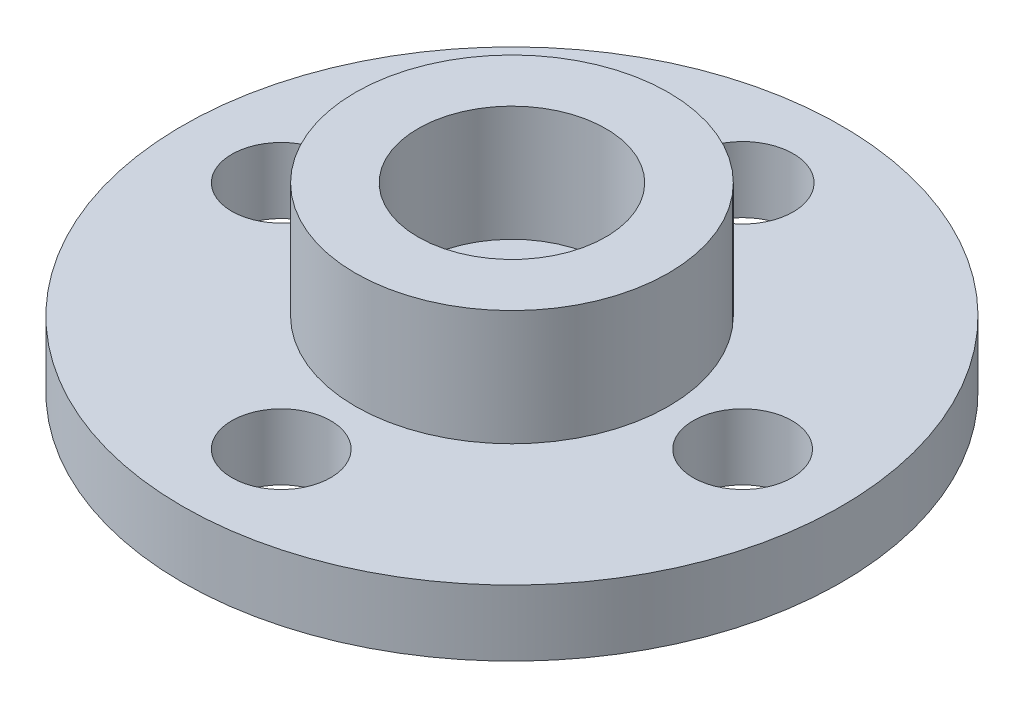
ISO-10303-21;
HEADER;
FILE_DESCRIPTION(('STEP AP214'),'2;1');
FILE_NAME('part.step','',(''),(''),'','','');
FILE_SCHEMA(('AUTOMOTIVE_DESIGN { 1 0 10303 214 1 1 1 1 }'));
ENDSEC;
DATA;
#1=APPLICATION_CONTEXT('core data for automotive mechanical design processes');
#2=APPLICATION_PROTOCOL_DEFINITION('international standard','automotive_design',2000,#1);
#3=PRODUCT_CONTEXT('',#1,'mechanical');
#4=PRODUCT('Part','Part','',(#3));
#5=PRODUCT_RELATED_PRODUCT_CATEGORY('part','',(#4));
#6=PRODUCT_DEFINITION_FORMATION('','',#4);
#7=PRODUCT_DEFINITION_CONTEXT('part definition',#1,'design');
#8=PRODUCT_DEFINITION('design','',#6,#7);
#9=PRODUCT_DEFINITION_SHAPE('','',#8);
#10=(LENGTH_UNIT() NAMED_UNIT(*) SI_UNIT(.MILLI.,.METRE.));
#11=(NAMED_UNIT(*) PLANE_ANGLE_UNIT() SI_UNIT($,.RADIAN.));
#12=(NAMED_UNIT(*) SI_UNIT($,.STERADIAN.) SOLID_ANGLE_UNIT());
#13=UNCERTAINTY_MEASURE_WITH_UNIT(LENGTH_MEASURE(1.E-05),#10,'distance_accuracy_value','');
#14=(GEOMETRIC_REPRESENTATION_CONTEXT(3) GLOBAL_UNCERTAINTY_ASSIGNED_CONTEXT((#13)) GLOBAL_UNIT_ASSIGNED_CONTEXT((#10,
#11,#12)) REPRESENTATION_CONTEXT('',''));
#15=CARTESIAN_POINT('',(0.,0.,0.));
#16=DIRECTION('',(0.,0.,1.));
#17=DIRECTION('',(1.,0.,0.));
#18=AXIS2_PLACEMENT_3D('',#15,#16,#17);
#19=CARTESIAN_POINT('',(0.,2.,0.));
#20=DIRECTION('',(0.,1.,0.));
#21=DIRECTION('',(0.,0.,1.));
#22=AXIS2_PLACEMENT_3D('',#19,#20,#21);
#23=PLANE('',#22);
#24=CARTESIAN_POINT('',(0.,2.,0.));
#25=DIRECTION('',(0.,1.,0.));
#26=DIRECTION('',(0.,0.,1.));
#27=AXIS2_PLACEMENT_3D('',#24,#25,#26);
#28=CIRCLE('',#27,1.5);
#29=CARTESIAN_POINT('',(0.,2.,1.5));
#30=VERTEX_POINT('',#29);
#31=EDGE_CURVE('E50',#30,#30,#28,.T.);
#32=ORIENTED_EDGE('',*,*,#31,.F.);
#33=EDGE_LOOP('',(#32));
#34=FACE_BOUND('',#33,.T.);
#35=CARTESIAN_POINT('',(0.,2.,0.));
#36=DIRECTION('',(0.,1.,0.));
#37=DIRECTION('',(0.,0.,1.));
#38=AXIS2_PLACEMENT_3D('',#35,#36,#37);
#39=CIRCLE('',#38,2.85);
#40=CARTESIAN_POINT('',(0.,2.,2.85));
#41=VERTEX_POINT('',#40);
#42=EDGE_CURVE('E10',#41,#41,#39,.F.);
#43=ORIENTED_EDGE('',*,*,#42,.F.);
#44=EDGE_LOOP('',(#43));
#45=FACE_BOUND('',#44,.T.);
#46=ADVANCED_FACE('F43',(#34,#45),#23,.T.);
#47=CARTESIAN_POINT('',(0.,2.,0.));
#48=DIRECTION('',(0.,-1.,0.));
#49=DIRECTION('',(0.,0.,-1.));
#50=AXIS2_PLACEMENT_3D('',#47,#48,#49);
#51=CYLINDRICAL_SURFACE('',#50,10.);
#52=CARTESIAN_POINT('',(0.,2.,0.));
#53=DIRECTION('',(0.,1.,0.));
#54=DIRECTION('',(0.,0.,1.));
#55=AXIS2_PLACEMENT_3D('',#52,#53,#54);
#56=CIRCLE('',#55,10.);
#57=CARTESIAN_POINT('',(0.,2.,10.));
#58=VERTEX_POINT('',#57);
#59=EDGE_CURVE('E54',#58,#58,#56,.T.);
#60=ORIENTED_EDGE('',*,*,#59,.F.);
#61=EDGE_LOOP('',(#60));
#62=FACE_BOUND('',#61,.T.);
#63=CARTESIAN_POINT('',(0.,0.,0.));
#64=DIRECTION('',(0.,1.,0.));
#65=DIRECTION('',(0.,0.,1.));
#66=AXIS2_PLACEMENT_3D('',#63,#64,#65);
#67=CIRCLE('',#66,10.);
#68=CARTESIAN_POINT('',(0.,0.,10.));
#69=VERTEX_POINT('',#68);
#70=EDGE_CURVE('E76',#69,#69,#67,.T.);
#71=ORIENTED_EDGE('',*,*,#70,.T.);
#72=EDGE_LOOP('',(#71));
#73=FACE_BOUND('',#72,.T.);
#74=ADVANCED_FACE('F111',(#62,#73),#51,.T.);
#75=CARTESIAN_POINT('',(0.,2.,-7.));
#76=DIRECTION('',(0.,-1.,0.));
#77=DIRECTION('',(0.,0.,-1.));
#78=AXIS2_PLACEMENT_3D('',#75,#76,#77);
#79=CYLINDRICAL_SURFACE('',#78,1.53349939265156);
#80=CARTESIAN_POINT('',(0.,2.,-7.));
#81=DIRECTION('',(0.,1.,0.));
#82=DIRECTION('',(0.,0.,1.));
#83=AXIS2_PLACEMENT_3D('',#80,#81,#82);
#84=CIRCLE('',#83,1.53349939265156);
#85=CARTESIAN_POINT('',(0.,2.,-5.46650060734844));
#86=VERTEX_POINT('',#85);
#87=EDGE_CURVE('E59',#86,#86,#84,.T.);
#88=ORIENTED_EDGE('',*,*,#87,.T.);
#89=EDGE_LOOP('',(#88));
#90=FACE_BOUND('',#89,.T.);
#91=CARTESIAN_POINT('',(0.,0.,-7.));
#92=DIRECTION('',(0.,1.,0.));
#93=DIRECTION('',(0.,0.,1.));
#94=AXIS2_PLACEMENT_3D('',#91,#92,#93);
#95=CIRCLE('',#94,1.53349939265156);
#96=CARTESIAN_POINT('',(0.,0.,-5.46650060734844));
#97=VERTEX_POINT('',#96);
#98=EDGE_CURVE('E73',#97,#97,#95,.T.);
#99=ORIENTED_EDGE('',*,*,#98,.F.);
#100=EDGE_LOOP('',(#99));
#101=FACE_BOUND('',#100,.T.);
#102=ADVANCED_FACE('F99',(#90,#101),#79,.F.);
#103=CARTESIAN_POINT('',(7.,2.,0.));
#104=DIRECTION('',(0.,-1.,0.));
#105=DIRECTION('',(0.,0.,-1.));
#106=AXIS2_PLACEMENT_3D('',#103,#104,#105);
#107=CYLINDRICAL_SURFACE('',#106,1.5);
#108=CARTESIAN_POINT('',(7.,2.,0.));
#109=DIRECTION('',(0.,1.,0.));
#110=DIRECTION('',(0.,0.,1.));
#111=AXIS2_PLACEMENT_3D('',#108,#109,#110);
#112=CIRCLE('',#111,1.5);
#113=CARTESIAN_POINT('',(7.,2.,1.5));
#114=VERTEX_POINT('',#113);
#115=EDGE_CURVE('E89',#114,#114,#112,.T.);
#116=ORIENTED_EDGE('',*,*,#115,.T.);
#117=EDGE_LOOP('',(#116));
#118=FACE_BOUND('',#117,.T.);
#119=CARTESIAN_POINT('',(7.,0.,0.));
#120=DIRECTION('',(0.,1.,0.));
#121=DIRECTION('',(0.,0.,1.));
#122=AXIS2_PLACEMENT_3D('',#119,#120,#121);
#123=CIRCLE('',#122,1.5);
#124=CARTESIAN_POINT('',(7.,0.,1.5));
#125=VERTEX_POINT('',#124);
#126=EDGE_CURVE('E70',#125,#125,#123,.T.);
#127=ORIENTED_EDGE('',*,*,#126,.F.);
#128=EDGE_LOOP('',(#127));
#129=FACE_BOUND('',#128,.T.);
#130=ADVANCED_FACE('F160',(#118,#129),#107,.F.);
#131=CARTESIAN_POINT('',(0.,2.,7.));
#132=DIRECTION('',(0.,-1.,0.));
#133=DIRECTION('',(0.,0.,-1.));
#134=AXIS2_PLACEMENT_3D('',#131,#132,#133);
#135=CYLINDRICAL_SURFACE('',#134,1.5);
#136=CARTESIAN_POINT('',(0.,2.,7.));
#137=DIRECTION('',(0.,1.,0.));
#138=DIRECTION('',(0.,0.,1.));
#139=AXIS2_PLACEMENT_3D('',#136,#137,#138);
#140=CIRCLE('',#139,1.5);
#141=CARTESIAN_POINT('',(0.,2.,8.5));
#142=VERTEX_POINT('',#141);
#143=EDGE_CURVE('E84',#142,#142,#140,.T.);
#144=ORIENTED_EDGE('',*,*,#143,.T.);
#145=EDGE_LOOP('',(#144));
#146=FACE_BOUND('',#145,.T.);
#147=CARTESIAN_POINT('',(0.,0.,7.));
#148=DIRECTION('',(0.,1.,0.));
#149=DIRECTION('',(0.,0.,1.));
#150=AXIS2_PLACEMENT_3D('',#147,#148,#149);
#151=CIRCLE('',#150,1.5);
#152=CARTESIAN_POINT('',(0.,0.,8.5));
#153=VERTEX_POINT('',#152);
#154=EDGE_CURVE('E66',#153,#153,#151,.T.);
#155=ORIENTED_EDGE('',*,*,#154,.F.);
#156=EDGE_LOOP('',(#155));
#157=FACE_BOUND('',#156,.T.);
#158=ADVANCED_FACE('F163',(#146,#157),#135,.F.);
#159=CARTESIAN_POINT('',(-7.,2.,0.));
#160=DIRECTION('',(0.,-1.,0.));
#161=DIRECTION('',(0.,0.,-1.));
#162=AXIS2_PLACEMENT_3D('',#159,#160,#161);
#163=CYLINDRICAL_SURFACE('',#162,1.5);
#164=CARTESIAN_POINT('',(-7.,2.,0.));
#165=DIRECTION('',(0.,1.,0.));
#166=DIRECTION('',(0.,0.,1.));
#167=AXIS2_PLACEMENT_3D('',#164,#165,#166);
#168=CIRCLE('',#167,1.5);
#169=CARTESIAN_POINT('',(-7.,2.,1.5));
#170=VERTEX_POINT('',#169);
#171=EDGE_CURVE('E80',#170,#170,#168,.T.);
#172=ORIENTED_EDGE('',*,*,#171,.T.);
#173=EDGE_LOOP('',(#172));
#174=FACE_BOUND('',#173,.T.);
#175=CARTESIAN_POINT('',(-7.,0.,0.));
#176=DIRECTION('',(0.,1.,0.));
#177=DIRECTION('',(0.,0.,1.));
#178=AXIS2_PLACEMENT_3D('',#175,#176,#177);
#179=CIRCLE('',#178,1.5);
#180=CARTESIAN_POINT('',(-7.,0.,1.5));
#181=VERTEX_POINT('',#180);
#182=EDGE_CURVE('E63',#181,#181,#179,.T.);
#183=ORIENTED_EDGE('',*,*,#182,.F.);
#184=EDGE_LOOP('',(#183));
#185=FACE_BOUND('',#184,.T.);
#186=ADVANCED_FACE('F45',(#174,#185),#163,.F.);
#187=CARTESIAN_POINT('',(0.,2.,0.));
#188=DIRECTION('',(0.,-1.,0.));
#189=DIRECTION('',(0.,0.,-1.));
#190=AXIS2_PLACEMENT_3D('',#187,#188,#189);
#191=CYLINDRICAL_SURFACE('',#190,1.5);
#192=ORIENTED_EDGE('',*,*,#31,.T.);
#193=EDGE_LOOP('',(#192));
#194=FACE_BOUND('',#193,.T.);
#195=CARTESIAN_POINT('',(0.,0.,0.));
#196=DIRECTION('',(0.,1.,0.));
#197=DIRECTION('',(0.,0.,1.));
#198=AXIS2_PLACEMENT_3D('',#195,#196,#197);
#199=CIRCLE('',#198,1.5);
#200=CARTESIAN_POINT('',(0.,0.,1.5));
#201=VERTEX_POINT('',#200);
#202=EDGE_CURVE('E78',#201,#201,#199,.T.);
#203=ORIENTED_EDGE('',*,*,#202,.F.);
#204=EDGE_LOOP('',(#203));
#205=FACE_BOUND('',#204,.T.);
#206=ADVANCED_FACE('F106',(#194,#205),#191,.F.);
#207=CARTESIAN_POINT('',(0.,2.,0.));
#208=DIRECTION('',(0.,1.,0.));
#209=DIRECTION('',(0.,0.,1.));
#210=AXIS2_PLACEMENT_3D('',#207,#208,#209);
#211=CIRCLE('',#210,4.75);
#212=CARTESIAN_POINT('',(0.,2.,4.75));
#213=VERTEX_POINT('',#212);
#214=EDGE_CURVE('E92',#213,#213,#211,.T.);
#215=ORIENTED_EDGE('',*,*,#214,.F.);
#216=EDGE_LOOP('',(#215));
#217=FACE_BOUND('',#216,.T.);
#218=ORIENTED_EDGE('',*,*,#171,.F.);
#219=EDGE_LOOP('',(#218));
#220=FACE_BOUND('',#219,.T.);
#221=ORIENTED_EDGE('',*,*,#143,.F.);
#222=EDGE_LOOP('',(#221));
#223=FACE_BOUND('',#222,.T.);
#224=ORIENTED_EDGE('',*,*,#115,.F.);
#225=EDGE_LOOP('',(#224));
#226=FACE_BOUND('',#225,.T.);
#227=ORIENTED_EDGE('',*,*,#87,.F.);
#228=EDGE_LOOP('',(#227));
#229=FACE_BOUND('',#228,.T.);
#230=ORIENTED_EDGE('',*,*,#59,.T.);
#231=EDGE_LOOP('',(#230));
#232=FACE_BOUND('',#231,.T.);
#233=ADVANCED_FACE('F102',(#217,#220,#223,#226,#229,#232),#23,.T.);
#234=CARTESIAN_POINT('',(0.,0.,0.));
#235=DIRECTION('',(0.,1.,0.));
#236=DIRECTION('',(0.,0.,1.));
#237=AXIS2_PLACEMENT_3D('',#234,#235,#236);
#238=PLANE('',#237);
#239=ORIENTED_EDGE('',*,*,#182,.T.);
#240=EDGE_LOOP('',(#239));
#241=FACE_BOUND('',#240,.T.);
#242=ORIENTED_EDGE('',*,*,#154,.T.);
#243=EDGE_LOOP('',(#242));
#244=FACE_BOUND('',#243,.T.);
#245=ORIENTED_EDGE('',*,*,#126,.T.);
#246=EDGE_LOOP('',(#245));
#247=FACE_BOUND('',#246,.T.);
#248=ORIENTED_EDGE('',*,*,#98,.T.);
#249=EDGE_LOOP('',(#248));
#250=FACE_BOUND('',#249,.T.);
#251=ORIENTED_EDGE('',*,*,#70,.F.);
#252=EDGE_LOOP('',(#251));
#253=FACE_BOUND('',#252,.T.);
#254=ORIENTED_EDGE('',*,*,#202,.T.);
#255=EDGE_LOOP('',(#254));
#256=FACE_BOUND('',#255,.T.);
#257=ADVANCED_FACE('F105',(#241,#244,#247,#250,#253,#256),#238,.F.);
#258=CARTESIAN_POINT('',(0.,5.5,0.));
#259=DIRECTION('',(0.,-1.,0.));
#260=DIRECTION('',(0.,0.,-1.));
#261=AXIS2_PLACEMENT_3D('',#258,#259,#260);
#262=CYLINDRICAL_SURFACE('',#261,2.85);
#263=CARTESIAN_POINT('',(0.,5.5,0.));
#264=DIRECTION('',(0.,1.,0.));
#265=DIRECTION('',(0.,0.,1.));
#266=AXIS2_PLACEMENT_3D('',#263,#264,#265);
#267=CIRCLE('',#266,2.85);
#268=CARTESIAN_POINT('',(0.,5.5,2.85));
#269=VERTEX_POINT('',#268);
#270=EDGE_CURVE('E147',#269,#269,#267,.T.);
#271=ORIENTED_EDGE('',*,*,#270,.T.);
#272=EDGE_LOOP('',(#271));
#273=FACE_BOUND('',#272,.T.);
#274=ORIENTED_EDGE('',*,*,#42,.T.);
#275=EDGE_LOOP('',(#274));
#276=FACE_BOUND('',#275,.T.);
#277=ADVANCED_FACE('F118',(#273,#276),#262,.F.);
#278=CARTESIAN_POINT('',(0.,5.5,0.));
#279=DIRECTION('',(0.,-1.,0.));
#280=DIRECTION('',(0.,0.,-1.));
#281=AXIS2_PLACEMENT_3D('',#278,#279,#280);
#282=CYLINDRICAL_SURFACE('',#281,4.75);
#283=CARTESIAN_POINT('',(0.,5.5,0.));
#284=DIRECTION('',(0.,1.,0.));
#285=DIRECTION('',(0.,0.,1.));
#286=AXIS2_PLACEMENT_3D('',#283,#284,#285);
#287=CIRCLE('',#286,4.75);
#288=CARTESIAN_POINT('',(0.,5.5,4.75));
#289=VERTEX_POINT('',#288);
#290=EDGE_CURVE('E67',#289,#289,#287,.T.);
#291=ORIENTED_EDGE('',*,*,#290,.F.);
#292=EDGE_LOOP('',(#291));
#293=FACE_BOUND('',#292,.T.);
#294=ORIENTED_EDGE('',*,*,#214,.T.);
#295=EDGE_LOOP('',(#294));
#296=FACE_BOUND('',#295,.T.);
#297=ADVANCED_FACE('F126',(#293,#296),#282,.T.);
#298=CARTESIAN_POINT('',(0.,5.5,0.));
#299=DIRECTION('',(0.,1.,0.));
#300=DIRECTION('',(0.,0.,1.));
#301=AXIS2_PLACEMENT_3D('',#298,#299,#300);
#302=PLANE('',#301);
#303=ORIENTED_EDGE('',*,*,#270,.F.);
#304=EDGE_LOOP('',(#303));
#305=FACE_BOUND('',#304,.T.);
#306=ORIENTED_EDGE('',*,*,#290,.T.);
#307=EDGE_LOOP('',(#306));
#308=FACE_BOUND('',#307,.T.);
#309=ADVANCED_FACE('F138',(#305,#308),#302,.T.);
#310=CLOSED_SHELL('',(#46,#74,#102,#130,#158,#186,#206,#233,#257,#277,#297,#309));
#311=MANIFOLD_SOLID_BREP('B2',#310);
#312=ADVANCED_BREP_SHAPE_REPRESENTATION('',(#18,#311),#14);
#313=SHAPE_DEFINITION_REPRESENTATION(#9,#312);
ENDSEC;
END-ISO-10303-21;
